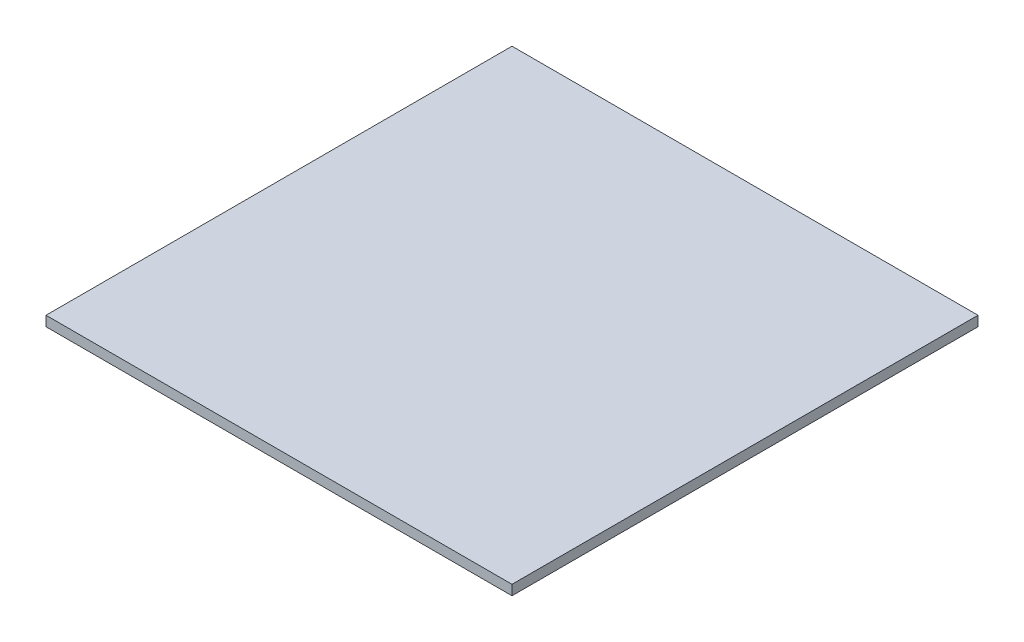
ISO-10303-21;
HEADER;
FILE_DESCRIPTION(('STEP AP214'),'2;1');
FILE_NAME('part.step','',(''),(''),'','','');
FILE_SCHEMA(('AUTOMOTIVE_DESIGN { 1 0 10303 214 1 1 1 1 }'));
ENDSEC;
DATA;
#1=APPLICATION_CONTEXT('core data for automotive mechanical design processes');
#2=APPLICATION_PROTOCOL_DEFINITION('international standard','automotive_design',2000,#1);
#3=PRODUCT_CONTEXT('',#1,'mechanical');
#4=PRODUCT('Part','Part','',(#3));
#5=PRODUCT_RELATED_PRODUCT_CATEGORY('part','',(#4));
#6=PRODUCT_DEFINITION_FORMATION('','',#4);
#7=PRODUCT_DEFINITION_CONTEXT('part definition',#1,'design');
#8=PRODUCT_DEFINITION('design','',#6,#7);
#9=PRODUCT_DEFINITION_SHAPE('','',#8);
#10=(LENGTH_UNIT() NAMED_UNIT(*) SI_UNIT(.MILLI.,.METRE.));
#11=(NAMED_UNIT(*) PLANE_ANGLE_UNIT() SI_UNIT($,.RADIAN.));
#12=(NAMED_UNIT(*) SI_UNIT($,.STERADIAN.) SOLID_ANGLE_UNIT());
#13=UNCERTAINTY_MEASURE_WITH_UNIT(LENGTH_MEASURE(1.E-05),#10,'distance_accuracy_value','');
#14=(GEOMETRIC_REPRESENTATION_CONTEXT(3) GLOBAL_UNCERTAINTY_ASSIGNED_CONTEXT((#13)) GLOBAL_UNIT_ASSIGNED_CONTEXT((#10,
#11,#12)) REPRESENTATION_CONTEXT('',''));
#15=CARTESIAN_POINT('',(0.,0.,0.));
#16=DIRECTION('',(0.,0.,1.));
#17=DIRECTION('',(1.,0.,0.));
#18=AXIS2_PLACEMENT_3D('',#15,#16,#17);
#19=CARTESIAN_POINT('',(48.995652173913,2.,-50.6565217391304));
#20=DIRECTION('',(1.,0.,0.));
#21=DIRECTION('',(0.,0.,-1.));
#22=AXIS2_PLACEMENT_3D('',#19,#20,#21);
#23=PLANE('',#22);
#24=DIRECTION('',(0.,0.,1.));
#25=VECTOR('',#24,1.);
#26=CARTESIAN_POINT('',(48.995652173913,0.,-50.6565217391304));
#27=LINE('',#26,#25);
#28=CARTESIAN_POINT('',(48.995652173913,0.,-50.6565217391304));
#29=VERTEX_POINT('',#28);
#30=CARTESIAN_POINT('',(48.995652173913,0.,42.8434782608696));
#31=VERTEX_POINT('',#30);
#32=EDGE_CURVE('E113',#29,#31,#27,.T.);
#33=ORIENTED_EDGE('',*,*,#32,.T.);
#34=DIRECTION('',(0.,-1.,0.));
#35=VECTOR('',#34,1.);
#36=CARTESIAN_POINT('',(48.995652173913,2.,42.8434782608696));
#37=LINE('',#36,#35);
#38=CARTESIAN_POINT('',(48.995652173913,2.,42.8434782608696));
#39=VERTEX_POINT('',#38);
#40=EDGE_CURVE('E11',#39,#31,#37,.T.);
#41=ORIENTED_EDGE('',*,*,#40,.F.);
#42=DIRECTION('',(0.,0.,1.));
#43=VECTOR('',#42,1.);
#44=CARTESIAN_POINT('',(48.995652173913,2.,-50.6565217391304));
#45=LINE('',#44,#43);
#46=CARTESIAN_POINT('',(48.995652173913,2.,-50.6565217391304));
#47=VERTEX_POINT('',#46);
#48=EDGE_CURVE('E97',#47,#39,#45,.T.);
#49=ORIENTED_EDGE('',*,*,#48,.F.);
#50=DIRECTION('',(0.,-1.,0.));
#51=VECTOR('',#50,1.);
#52=CARTESIAN_POINT('',(48.995652173913,2.,-50.6565217391304));
#53=LINE('',#52,#51);
#54=EDGE_CURVE('E109',#47,#29,#53,.T.);
#55=ORIENTED_EDGE('',*,*,#54,.T.);
#56=EDGE_LOOP('',(#33,#41,#49,#55));
#57=FACE_BOUND('',#56,.T.);
#58=ADVANCED_FACE('F45',(#57),#23,.F.);
#59=CARTESIAN_POINT('',(48.995652173913,2.,42.8434782608696));
#60=DIRECTION('',(0.,0.,-1.));
#61=DIRECTION('',(-1.,0.,0.));
#62=AXIS2_PLACEMENT_3D('',#59,#60,#61);
#63=PLANE('',#62);
#64=DIRECTION('',(1.,0.,0.));
#65=VECTOR('',#64,1.);
#66=CARTESIAN_POINT('',(48.995652173913,0.,42.8434782608696));
#67=LINE('',#66,#65);
#68=CARTESIAN_POINT('',(142.495652173913,0.,42.8434782608696));
#69=VERTEX_POINT('',#68);
#70=EDGE_CURVE('E102',#31,#69,#67,.T.);
#71=ORIENTED_EDGE('',*,*,#70,.T.);
#72=DIRECTION('',(0.,-1.,0.));
#73=VECTOR('',#72,1.);
#74=CARTESIAN_POINT('',(142.495652173913,2.,42.8434782608696));
#75=LINE('',#74,#73);
#76=CARTESIAN_POINT('',(142.495652173913,2.,42.8434782608696));
#77=VERTEX_POINT('',#76);
#78=EDGE_CURVE('E54',#77,#69,#75,.T.);
#79=ORIENTED_EDGE('',*,*,#78,.F.);
#80=DIRECTION('',(1.,0.,0.));
#81=VECTOR('',#80,1.);
#82=CARTESIAN_POINT('',(48.995652173913,2.,42.8434782608696));
#83=LINE('',#82,#81);
#84=EDGE_CURVE('E92',#39,#77,#83,.T.);
#85=ORIENTED_EDGE('',*,*,#84,.F.);
#86=ORIENTED_EDGE('',*,*,#40,.T.);
#87=EDGE_LOOP('',(#71,#79,#85,#86));
#88=FACE_BOUND('',#87,.T.);
#89=ADVANCED_FACE('F101',(#88),#63,.F.);
#90=CARTESIAN_POINT('',(142.495652173913,2.,-50.6565217391304));
#91=DIRECTION('',(-1.,0.,0.));
#92=DIRECTION('',(0.,0.,1.));
#93=AXIS2_PLACEMENT_3D('',#90,#91,#92);
#94=PLANE('',#93);
#95=DIRECTION('',(0.,0.,-1.));
#96=VECTOR('',#95,1.);
#97=CARTESIAN_POINT('',(142.495652173913,0.,-50.6565217391304));
#98=LINE('',#97,#96);
#99=CARTESIAN_POINT('',(142.495652173913,0.,-50.6565217391304));
#100=VERTEX_POINT('',#99);
#101=EDGE_CURVE('E79',#69,#100,#98,.T.);
#102=ORIENTED_EDGE('',*,*,#101,.T.);
#103=DIRECTION('',(0.,-1.,0.));
#104=VECTOR('',#103,1.);
#105=CARTESIAN_POINT('',(142.495652173913,2.,-50.6565217391304));
#106=LINE('',#105,#104);
#107=CARTESIAN_POINT('',(142.495652173913,2.,-50.6565217391304));
#108=VERTEX_POINT('',#107);
#109=EDGE_CURVE('E104',#108,#100,#106,.T.);
#110=ORIENTED_EDGE('',*,*,#109,.F.);
#111=DIRECTION('',(0.,0.,-1.));
#112=VECTOR('',#111,1.);
#113=CARTESIAN_POINT('',(142.495652173913,2.,-50.6565217391304));
#114=LINE('',#113,#112);
#115=EDGE_CURVE('E95',#77,#108,#114,.T.);
#116=ORIENTED_EDGE('',*,*,#115,.F.);
#117=ORIENTED_EDGE('',*,*,#78,.T.);
#118=EDGE_LOOP('',(#102,#110,#116,#117));
#119=FACE_BOUND('',#118,.T.);
#120=ADVANCED_FACE('F105',(#119),#94,.F.);
#121=CARTESIAN_POINT('',(48.995652173913,2.,-50.6565217391304));
#122=DIRECTION('',(0.,0.,1.));
#123=DIRECTION('',(1.,0.,0.));
#124=AXIS2_PLACEMENT_3D('',#121,#122,#123);
#125=PLANE('',#124);
#126=DIRECTION('',(-1.,0.,0.));
#127=VECTOR('',#126,1.);
#128=CARTESIAN_POINT('',(48.995652173913,0.,-50.6565217391304));
#129=LINE('',#128,#127);
#130=EDGE_CURVE('E85',#100,#29,#129,.T.);
#131=ORIENTED_EDGE('',*,*,#130,.T.);
#132=ORIENTED_EDGE('',*,*,#54,.F.);
#133=DIRECTION('',(-1.,0.,0.));
#134=VECTOR('',#133,1.);
#135=CARTESIAN_POINT('',(48.995652173913,2.,-50.6565217391304));
#136=LINE('',#135,#134);
#137=EDGE_CURVE('E62',#108,#47,#136,.T.);
#138=ORIENTED_EDGE('',*,*,#137,.F.);
#139=ORIENTED_EDGE('',*,*,#109,.T.);
#140=EDGE_LOOP('',(#131,#132,#138,#139));
#141=FACE_BOUND('',#140,.T.);
#142=ADVANCED_FACE('F126',(#141),#125,.F.);
#143=CARTESIAN_POINT('',(0.,2.,0.));
#144=DIRECTION('',(0.,1.,0.));
#145=DIRECTION('',(0.,0.,1.));
#146=AXIS2_PLACEMENT_3D('',#143,#144,#145);
#147=PLANE('',#146);
#148=ORIENTED_EDGE('',*,*,#48,.T.);
#149=ORIENTED_EDGE('',*,*,#84,.T.);
#150=ORIENTED_EDGE('',*,*,#115,.T.);
#151=ORIENTED_EDGE('',*,*,#137,.T.);
#152=EDGE_LOOP('',(#148,#149,#150,#151));
#153=FACE_BOUND('',#152,.T.);
#154=ADVANCED_FACE('F93',(#153),#147,.T.);
#155=CARTESIAN_POINT('',(0.,0.,0.));
#156=DIRECTION('',(0.,1.,0.));
#157=DIRECTION('',(0.,0.,1.));
#158=AXIS2_PLACEMENT_3D('',#155,#156,#157);
#159=PLANE('',#158);
#160=ORIENTED_EDGE('',*,*,#32,.F.);
#161=ORIENTED_EDGE('',*,*,#130,.F.);
#162=ORIENTED_EDGE('',*,*,#101,.F.);
#163=ORIENTED_EDGE('',*,*,#70,.F.);
#164=EDGE_LOOP('',(#160,#161,#162,#163));
#165=FACE_BOUND('',#164,.T.);
#166=ADVANCED_FACE('F129',(#165),#159,.F.);
#167=CLOSED_SHELL('',(#58,#89,#120,#142,#154,#166));
#168=MANIFOLD_SOLID_BREP('B2',#167);
#169=ADVANCED_BREP_SHAPE_REPRESENTATION('',(#18,#168),#14);
#170=SHAPE_DEFINITION_REPRESENTATION(#9,#169);
ENDSEC;
END-ISO-10303-21;
